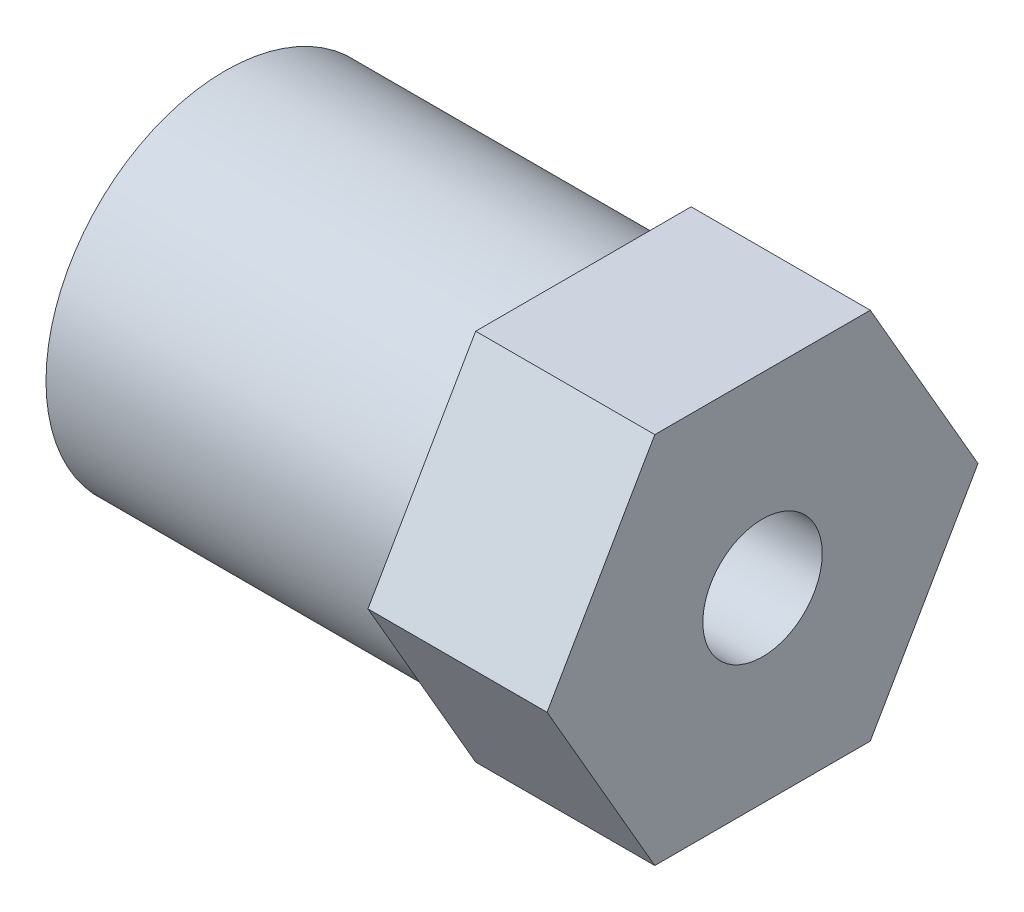
ISO-10303-21;
HEADER;
FILE_DESCRIPTION(('STEP AP214'),'2;1');
FILE_NAME('part.step','',(''),(''),'','','');
FILE_SCHEMA(('AUTOMOTIVE_DESIGN { 1 0 10303 214 1 1 1 1 }'));
ENDSEC;
DATA;
#1=APPLICATION_CONTEXT('core data for automotive mechanical design processes');
#2=APPLICATION_PROTOCOL_DEFINITION('international standard','automotive_design',2000,#1);
#3=PRODUCT_CONTEXT('',#1,'mechanical');
#4=PRODUCT('Part','Part','',(#3));
#5=PRODUCT_RELATED_PRODUCT_CATEGORY('part','',(#4));
#6=PRODUCT_DEFINITION_FORMATION('','',#4);
#7=PRODUCT_DEFINITION_CONTEXT('part definition',#1,'design');
#8=PRODUCT_DEFINITION('design','',#6,#7);
#9=PRODUCT_DEFINITION_SHAPE('','',#8);
#10=(LENGTH_UNIT() NAMED_UNIT(*) SI_UNIT(.MILLI.,.METRE.));
#11=(NAMED_UNIT(*) PLANE_ANGLE_UNIT() SI_UNIT($,.RADIAN.));
#12=(NAMED_UNIT(*) SI_UNIT($,.STERADIAN.) SOLID_ANGLE_UNIT());
#13=UNCERTAINTY_MEASURE_WITH_UNIT(LENGTH_MEASURE(1.E-05),#10,'distance_accuracy_value','');
#14=(GEOMETRIC_REPRESENTATION_CONTEXT(3) GLOBAL_UNCERTAINTY_ASSIGNED_CONTEXT((#13)) GLOBAL_UNIT_ASSIGNED_CONTEXT((#10,
#11,#12)) REPRESENTATION_CONTEXT('',''));
#15=CARTESIAN_POINT('',(0.,0.,0.));
#16=DIRECTION('',(0.,0.,1.));
#17=DIRECTION('',(1.,0.,0.));
#18=AXIS2_PLACEMENT_3D('',#15,#16,#17);
#19=CARTESIAN_POINT('',(6.,-6.25,-3.60843918243516));
#20=DIRECTION('',(0.,0.5,0.866025403784438));
#21=DIRECTION('',(0.,-0.866025403784439,0.5));
#22=AXIS2_PLACEMENT_3D('',#19,#20,#21);
#23=PLANE('',#22);
#24=DIRECTION('',(0.,0.866025403784439,-0.5));
#25=VECTOR('',#24,1.);
#26=CARTESIAN_POINT('',(0.,-6.25,-3.60843918243516));
#27=LINE('',#26,#25);
#28=CARTESIAN_POINT('',(0.,-6.25,-3.60843918243516));
#29=VERTEX_POINT('',#28);
#30=CARTESIAN_POINT('',(0.,0.,-7.21687836487033));
#31=VERTEX_POINT('',#30);
#32=EDGE_CURVE('E125',#29,#31,#27,.T.);
#33=ORIENTED_EDGE('',*,*,#32,.T.);
#34=DIRECTION('',(-1.,0.,0.));
#35=VECTOR('',#34,1.);
#36=CARTESIAN_POINT('',(6.,0.,-7.21687836487033));
#37=LINE('',#36,#35);
#38=CARTESIAN_POINT('',(6.,0.,-7.21687836487033));
#39=VERTEX_POINT('',#38);
#40=EDGE_CURVE('E48',#39,#31,#37,.T.);
#41=ORIENTED_EDGE('',*,*,#40,.F.);
#42=DIRECTION('',(0.,0.866025403784439,-0.5));
#43=VECTOR('',#42,1.);
#44=CARTESIAN_POINT('',(6.,-6.25,-3.60843918243516));
#45=LINE('',#44,#43);
#46=CARTESIAN_POINT('',(6.,-6.25,-3.60843918243516));
#47=VERTEX_POINT('',#46);
#48=EDGE_CURVE('E136',#47,#39,#45,.T.);
#49=ORIENTED_EDGE('',*,*,#48,.F.);
#50=DIRECTION('',(-1.,0.,0.));
#51=VECTOR('',#50,1.);
#52=CARTESIAN_POINT('',(6.,-6.25,-3.60843918243516));
#53=LINE('',#52,#51);
#54=EDGE_CURVE('E121',#47,#29,#53,.T.);
#55=ORIENTED_EDGE('',*,*,#54,.T.);
#56=EDGE_LOOP('',(#33,#41,#49,#55));
#57=FACE_BOUND('',#56,.T.);
#58=ADVANCED_FACE('F39',(#57),#23,.F.);
#59=CARTESIAN_POINT('',(6.,0.,-7.21687836487033));
#60=DIRECTION('',(0.,-0.5,0.866025403784438));
#61=DIRECTION('',(0.,-0.866025403784439,-0.5));
#62=AXIS2_PLACEMENT_3D('',#59,#60,#61);
#63=PLANE('',#62);
#64=DIRECTION('',(0.,0.866025403784439,0.5));
#65=VECTOR('',#64,1.);
#66=CARTESIAN_POINT('',(0.,0.,-7.21687836487033));
#67=LINE('',#66,#65);
#68=CARTESIAN_POINT('',(0.,6.25,-3.60843918243516));
#69=VERTEX_POINT('',#68);
#70=EDGE_CURVE('E128',#31,#69,#67,.T.);
#71=ORIENTED_EDGE('',*,*,#70,.T.);
#72=DIRECTION('',(-1.,0.,0.));
#73=VECTOR('',#72,1.);
#74=CARTESIAN_POINT('',(6.,6.25,-3.60843918243516));
#75=LINE('',#74,#73);
#76=CARTESIAN_POINT('',(6.,6.25,-3.60843918243516));
#77=VERTEX_POINT('',#76);
#78=EDGE_CURVE('E140',#77,#69,#75,.T.);
#79=ORIENTED_EDGE('',*,*,#78,.F.);
#80=DIRECTION('',(0.,0.866025403784439,0.5));
#81=VECTOR('',#80,1.);
#82=CARTESIAN_POINT('',(6.,0.,-7.21687836487033));
#83=LINE('',#82,#81);
#84=EDGE_CURVE('E94',#39,#77,#83,.T.);
#85=ORIENTED_EDGE('',*,*,#84,.F.);
#86=ORIENTED_EDGE('',*,*,#40,.T.);
#87=EDGE_LOOP('',(#71,#79,#85,#86));
#88=FACE_BOUND('',#87,.T.);
#89=ADVANCED_FACE('F144',(#88),#63,.F.);
#90=CARTESIAN_POINT('',(6.,6.25,-3.60843918243516));
#91=DIRECTION('',(0.,-1.,0.));
#92=DIRECTION('',(0.,0.,-1.));
#93=AXIS2_PLACEMENT_3D('',#90,#91,#92);
#94=PLANE('',#93);
#95=DIRECTION('',(0.,0.,1.));
#96=VECTOR('',#95,1.);
#97=CARTESIAN_POINT('',(0.,6.25,-3.60843918243516));
#98=LINE('',#97,#96);
#99=CARTESIAN_POINT('',(0.,6.25,3.60843918243516));
#100=VERTEX_POINT('',#99);
#101=EDGE_CURVE('E131',#69,#100,#98,.T.);
#102=ORIENTED_EDGE('',*,*,#101,.T.);
#103=DIRECTION('',(-1.,0.,0.));
#104=VECTOR('',#103,1.);
#105=CARTESIAN_POINT('',(6.,6.25,3.60843918243516));
#106=LINE('',#105,#104);
#107=CARTESIAN_POINT('',(6.,6.25,3.60843918243516));
#108=VERTEX_POINT('',#107);
#109=EDGE_CURVE('E116',#108,#100,#106,.T.);
#110=ORIENTED_EDGE('',*,*,#109,.F.);
#111=DIRECTION('',(0.,0.,1.));
#112=VECTOR('',#111,1.);
#113=CARTESIAN_POINT('',(6.,6.25,-3.60843918243516));
#114=LINE('',#113,#112);
#115=EDGE_CURVE('E107',#77,#108,#114,.T.);
#116=ORIENTED_EDGE('',*,*,#115,.F.);
#117=ORIENTED_EDGE('',*,*,#78,.T.);
#118=EDGE_LOOP('',(#102,#110,#116,#117));
#119=FACE_BOUND('',#118,.T.);
#120=ADVANCED_FACE('F152',(#119),#94,.F.);
#121=CARTESIAN_POINT('',(6.,6.25,3.60843918243516));
#122=DIRECTION('',(0.,-0.5,-0.866025403784439));
#123=DIRECTION('',(0.,0.866025403784439,-0.5));
#124=AXIS2_PLACEMENT_3D('',#121,#122,#123);
#125=PLANE('',#124);
#126=DIRECTION('',(0.,-0.866025403784438,0.5));
#127=VECTOR('',#126,1.);
#128=CARTESIAN_POINT('',(0.,6.25,3.60843918243516));
#129=LINE('',#128,#127);
#130=CARTESIAN_POINT('',(0.,0.,7.21687836487032));
#131=VERTEX_POINT('',#130);
#132=EDGE_CURVE('E115',#100,#131,#129,.T.);
#133=ORIENTED_EDGE('',*,*,#132,.T.);
#134=DIRECTION('',(-1.,0.,0.));
#135=VECTOR('',#134,1.);
#136=CARTESIAN_POINT('',(6.,0.,7.21687836487032));
#137=LINE('',#136,#135);
#138=CARTESIAN_POINT('',(6.,0.,7.21687836487032));
#139=VERTEX_POINT('',#138);
#140=EDGE_CURVE('E112',#139,#131,#137,.T.);
#141=ORIENTED_EDGE('',*,*,#140,.F.);
#142=DIRECTION('',(0.,-0.866025403784438,0.5));
#143=VECTOR('',#142,1.);
#144=CARTESIAN_POINT('',(6.,6.25,3.60843918243516));
#145=LINE('',#144,#143);
#146=EDGE_CURVE('E101',#108,#139,#145,.T.);
#147=ORIENTED_EDGE('',*,*,#146,.F.);
#148=ORIENTED_EDGE('',*,*,#109,.T.);
#149=EDGE_LOOP('',(#133,#141,#147,#148));
#150=FACE_BOUND('',#149,.T.);
#151=ADVANCED_FACE('F113',(#150),#125,.F.);
#152=CARTESIAN_POINT('',(6.,0.,7.21687836487032));
#153=DIRECTION('',(0.,0.5,-0.866025403784438));
#154=DIRECTION('',(0.,0.866025403784438,0.5));
#155=AXIS2_PLACEMENT_3D('',#152,#153,#154);
#156=PLANE('',#155);
#157=DIRECTION('',(0.,-0.866025403784438,-0.5));
#158=VECTOR('',#157,1.);
#159=CARTESIAN_POINT('',(0.,0.,7.21687836487032));
#160=LINE('',#159,#158);
#161=CARTESIAN_POINT('',(0.,-6.25,3.60843918243516));
#162=VERTEX_POINT('',#161);
#163=EDGE_CURVE('E79',#131,#162,#160,.T.);
#164=ORIENTED_EDGE('',*,*,#163,.T.);
#165=DIRECTION('',(-1.,0.,0.));
#166=VECTOR('',#165,1.);
#167=CARTESIAN_POINT('',(6.,-6.25,3.60843918243516));
#168=LINE('',#167,#166);
#169=CARTESIAN_POINT('',(6.,-6.25,3.60843918243516));
#170=VERTEX_POINT('',#169);
#171=EDGE_CURVE('E117',#170,#162,#168,.T.);
#172=ORIENTED_EDGE('',*,*,#171,.F.);
#173=DIRECTION('',(0.,-0.866025403784438,-0.5));
#174=VECTOR('',#173,1.);
#175=CARTESIAN_POINT('',(6.,0.,7.21687836487032));
#176=LINE('',#175,#174);
#177=EDGE_CURVE('E105',#139,#170,#176,.T.);
#178=ORIENTED_EDGE('',*,*,#177,.F.);
#179=ORIENTED_EDGE('',*,*,#140,.T.);
#180=EDGE_LOOP('',(#164,#172,#178,#179));
#181=FACE_BOUND('',#180,.T.);
#182=ADVANCED_FACE('F119',(#181),#156,.F.);
#183=CARTESIAN_POINT('',(6.,-6.25,3.60843918243516));
#184=DIRECTION('',(0.,1.,0.));
#185=DIRECTION('',(0.,0.,1.));
#186=AXIS2_PLACEMENT_3D('',#183,#184,#185);
#187=PLANE('',#186);
#188=DIRECTION('',(0.,0.,-1.));
#189=VECTOR('',#188,1.);
#190=CARTESIAN_POINT('',(0.,-6.25,3.60843918243516));
#191=LINE('',#190,#189);
#192=EDGE_CURVE('E85',#162,#29,#191,.T.);
#193=ORIENTED_EDGE('',*,*,#192,.T.);
#194=ORIENTED_EDGE('',*,*,#54,.F.);
#195=DIRECTION('',(0.,0.,-1.));
#196=VECTOR('',#195,1.);
#197=CARTESIAN_POINT('',(6.,-6.25,3.60843918243516));
#198=LINE('',#197,#196);
#199=EDGE_CURVE('E56',#170,#47,#198,.T.);
#200=ORIENTED_EDGE('',*,*,#199,.F.);
#201=ORIENTED_EDGE('',*,*,#171,.T.);
#202=EDGE_LOOP('',(#193,#194,#200,#201));
#203=FACE_BOUND('',#202,.T.);
#204=ADVANCED_FACE('F203',(#203),#187,.F.);
#205=CARTESIAN_POINT('',(6.,0.,0.));
#206=DIRECTION('',(1.,0.,0.));
#207=DIRECTION('',(0.,0.,-1.));
#208=AXIS2_PLACEMENT_3D('',#205,#206,#207);
#209=PLANE('',#208);
#210=CARTESIAN_POINT('',(6.,0.,0.));
#211=DIRECTION('',(1.,0.,0.));
#212=DIRECTION('',(0.,0.,-1.));
#213=AXIS2_PLACEMENT_3D('',#210,#211,#212);
#214=CIRCLE('',#213,2.);
#215=CARTESIAN_POINT('',(6.,0.,-2.));
#216=VERTEX_POINT('',#215);
#217=EDGE_CURVE('E164',#216,#216,#214,.T.);
#218=ORIENTED_EDGE('',*,*,#217,.F.);
#219=EDGE_LOOP('',(#218));
#220=FACE_BOUND('',#219,.T.);
#221=ORIENTED_EDGE('',*,*,#48,.T.);
#222=ORIENTED_EDGE('',*,*,#84,.T.);
#223=ORIENTED_EDGE('',*,*,#115,.T.);
#224=ORIENTED_EDGE('',*,*,#146,.T.);
#225=ORIENTED_EDGE('',*,*,#177,.T.);
#226=ORIENTED_EDGE('',*,*,#199,.T.);
#227=EDGE_LOOP('',(#221,#222,#223,#224,#225,#226));
#228=FACE_BOUND('',#227,.T.);
#229=ADVANCED_FACE('F103',(#220,#228),#209,.T.);
#230=CARTESIAN_POINT('',(0.,0.,0.));
#231=DIRECTION('',(1.,0.,0.));
#232=DIRECTION('',(0.,0.,-1.));
#233=AXIS2_PLACEMENT_3D('',#230,#231,#232);
#234=PLANE('',#233);
#235=CARTESIAN_POINT('',(0.,0.,0.));
#236=DIRECTION('',(1.,0.,0.));
#237=DIRECTION('',(0.,0.,-1.));
#238=AXIS2_PLACEMENT_3D('',#235,#236,#237);
#239=CIRCLE('',#238,6.);
#240=CARTESIAN_POINT('',(0.,0.,-6.));
#241=VERTEX_POINT('',#240);
#242=EDGE_CURVE('E11',#241,#241,#239,.F.);
#243=ORIENTED_EDGE('',*,*,#242,.F.);
#244=EDGE_LOOP('',(#243));
#245=FACE_BOUND('',#244,.T.);
#246=ORIENTED_EDGE('',*,*,#32,.F.);
#247=ORIENTED_EDGE('',*,*,#192,.F.);
#248=ORIENTED_EDGE('',*,*,#163,.F.);
#249=ORIENTED_EDGE('',*,*,#132,.F.);
#250=ORIENTED_EDGE('',*,*,#101,.F.);
#251=ORIENTED_EDGE('',*,*,#70,.F.);
#252=EDGE_LOOP('',(#246,#247,#248,#249,#250,#251));
#253=FACE_BOUND('',#252,.T.);
#254=ADVANCED_FACE('F149',(#245,#253),#234,.F.);
#255=CARTESIAN_POINT('',(-12.,0.,0.));
#256=DIRECTION('',(1.,0.,0.));
#257=DIRECTION('',(0.,0.,-1.));
#258=AXIS2_PLACEMENT_3D('',#255,#256,#257);
#259=CYLINDRICAL_SURFACE('',#258,6.);
#260=CARTESIAN_POINT('',(-12.,0.,0.));
#261=DIRECTION('',(-1.,0.,0.));
#262=DIRECTION('',(0.,0.,1.));
#263=AXIS2_PLACEMENT_3D('',#260,#261,#262);
#264=CIRCLE('',#263,6.);
#265=CARTESIAN_POINT('',(-12.,0.,6.));
#266=VERTEX_POINT('',#265);
#267=EDGE_CURVE('E129',#266,#266,#264,.T.);
#268=ORIENTED_EDGE('',*,*,#267,.F.);
#269=EDGE_LOOP('',(#268));
#270=FACE_BOUND('',#269,.T.);
#271=ORIENTED_EDGE('',*,*,#242,.T.);
#272=EDGE_LOOP('',(#271));
#273=FACE_BOUND('',#272,.T.);
#274=ADVANCED_FACE('F188',(#270,#273),#259,.T.);
#275=CARTESIAN_POINT('',(-12.,0.,0.));
#276=DIRECTION('',(-1.,0.,0.));
#277=DIRECTION('',(0.,0.,1.));
#278=AXIS2_PLACEMENT_3D('',#275,#276,#277);
#279=PLANE('',#278);
#280=CARTESIAN_POINT('',(-12.,0.,0.));
#281=DIRECTION('',(-1.,0.,0.));
#282=DIRECTION('',(0.,0.,1.));
#283=AXIS2_PLACEMENT_3D('',#280,#281,#282);
#284=CIRCLE('',#283,3.);
#285=CARTESIAN_POINT('',(-12.,0.,3.));
#286=VERTEX_POINT('',#285);
#287=EDGE_CURVE('E159',#286,#286,#284,.T.);
#288=ORIENTED_EDGE('',*,*,#287,.F.);
#289=EDGE_LOOP('',(#288));
#290=FACE_BOUND('',#289,.T.);
#291=ORIENTED_EDGE('',*,*,#267,.T.);
#292=EDGE_LOOP('',(#291));
#293=FACE_BOUND('',#292,.T.);
#294=ADVANCED_FACE('F182',(#290,#293),#279,.T.);
#295=CARTESIAN_POINT('',(0.,0.,0.));
#296=DIRECTION('',(-1.,0.,0.));
#297=DIRECTION('',(0.,0.,1.));
#298=AXIS2_PLACEMENT_3D('',#295,#296,#297);
#299=CYLINDRICAL_SURFACE('',#298,3.);
#300=CARTESIAN_POINT('',(0.,0.,0.));
#301=DIRECTION('',(-1.,0.,0.));
#302=DIRECTION('',(0.,0.,1.));
#303=AXIS2_PLACEMENT_3D('',#300,#301,#302);
#304=CIRCLE('',#303,3.);
#305=CARTESIAN_POINT('',(0.,0.,3.));
#306=VERTEX_POINT('',#305);
#307=EDGE_CURVE('E158',#306,#306,#304,.T.);
#308=ORIENTED_EDGE('',*,*,#307,.F.);
#309=EDGE_LOOP('',(#308));
#310=FACE_BOUND('',#309,.T.);
#311=ORIENTED_EDGE('',*,*,#287,.T.);
#312=EDGE_LOOP('',(#311));
#313=FACE_BOUND('',#312,.T.);
#314=ADVANCED_FACE('F176',(#310,#313),#299,.F.);
#315=CARTESIAN_POINT('',(0.,0.,0.));
#316=DIRECTION('',(-1.,0.,0.));
#317=DIRECTION('',(0.,0.,1.));
#318=AXIS2_PLACEMENT_3D('',#315,#316,#317);
#319=PLANE('',#318);
#320=CARTESIAN_POINT('',(0.,0.,0.));
#321=DIRECTION('',(-1.,0.,0.));
#322=DIRECTION('',(0.,0.,1.));
#323=AXIS2_PLACEMENT_3D('',#320,#321,#322);
#324=CIRCLE('',#323,2.);
#325=CARTESIAN_POINT('',(0.,0.,2.));
#326=VERTEX_POINT('',#325);
#327=EDGE_CURVE('E42',#326,#326,#324,.T.);
#328=ORIENTED_EDGE('',*,*,#327,.F.);
#329=EDGE_LOOP('',(#328));
#330=FACE_BOUND('',#329,.T.);
#331=ORIENTED_EDGE('',*,*,#307,.T.);
#332=EDGE_LOOP('',(#331));
#333=FACE_BOUND('',#332,.T.);
#334=ADVANCED_FACE('F173',(#330,#333),#319,.T.);
#335=CARTESIAN_POINT('',(-12.,0.,0.));
#336=DIRECTION('',(1.,0.,0.));
#337=DIRECTION('',(0.,0.,-1.));
#338=AXIS2_PLACEMENT_3D('',#335,#336,#337);
#339=CYLINDRICAL_SURFACE('',#338,2.);
#340=ORIENTED_EDGE('',*,*,#327,.T.);
#341=EDGE_LOOP('',(#340));
#342=FACE_BOUND('',#341,.T.);
#343=ORIENTED_EDGE('',*,*,#217,.T.);
#344=EDGE_LOOP('',(#343));
#345=FACE_BOUND('',#344,.T.);
#346=ADVANCED_FACE('F171',(#342,#345),#339,.F.);
#347=CLOSED_SHELL('',(#58,#89,#120,#151,#182,#204,#229,#254,#274,#294,#314,#334,#346));
#348=MANIFOLD_SOLID_BREP('B2',#347);
#349=ADVANCED_BREP_SHAPE_REPRESENTATION('',(#18,#348),#14);
#350=SHAPE_DEFINITION_REPRESENTATION(#9,#349);
ENDSEC;
END-ISO-10303-21;
